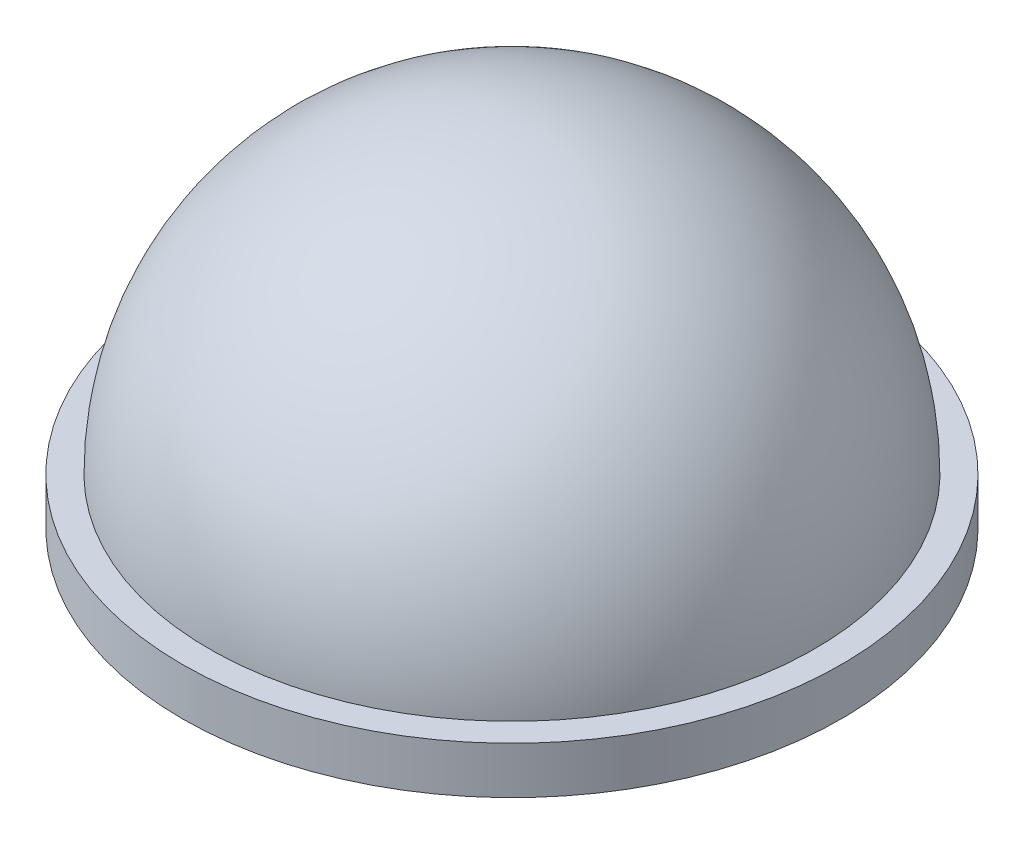
ISO-10303-21;
HEADER;
FILE_DESCRIPTION(('STEP AP214'),'2;1');
FILE_NAME('part.step','',(''),(''),'','','');
FILE_SCHEMA(('AUTOMOTIVE_DESIGN { 1 0 10303 214 1 1 1 1 }'));
ENDSEC;
DATA;
#1=APPLICATION_CONTEXT('core data for automotive mechanical design processes');
#2=APPLICATION_PROTOCOL_DEFINITION('international standard','automotive_design',2000,#1);
#3=PRODUCT_CONTEXT('',#1,'mechanical');
#4=PRODUCT('Part','Part','',(#3));
#5=PRODUCT_RELATED_PRODUCT_CATEGORY('part','',(#4));
#6=PRODUCT_DEFINITION_FORMATION('','',#4);
#7=PRODUCT_DEFINITION_CONTEXT('part definition',#1,'design');
#8=PRODUCT_DEFINITION('design','',#6,#7);
#9=PRODUCT_DEFINITION_SHAPE('','',#8);
#10=(LENGTH_UNIT() NAMED_UNIT(*) SI_UNIT(.MILLI.,.METRE.));
#11=(NAMED_UNIT(*) PLANE_ANGLE_UNIT() SI_UNIT($,.RADIAN.));
#12=(NAMED_UNIT(*) SI_UNIT($,.STERADIAN.) SOLID_ANGLE_UNIT());
#13=UNCERTAINTY_MEASURE_WITH_UNIT(LENGTH_MEASURE(1.E-05),#10,'distance_accuracy_value','');
#14=(GEOMETRIC_REPRESENTATION_CONTEXT(3) GLOBAL_UNCERTAINTY_ASSIGNED_CONTEXT((#13)) GLOBAL_UNIT_ASSIGNED_CONTEXT((#10,
#11,#12)) REPRESENTATION_CONTEXT('',''));
#15=CARTESIAN_POINT('',(0.,0.,0.));
#16=DIRECTION('',(0.,0.,1.));
#17=DIRECTION('',(1.,0.,0.));
#18=AXIS2_PLACEMENT_3D('',#15,#16,#17);
#19=CARTESIAN_POINT('',(0.,0.7,0.));
#20=DIRECTION('',(0.,-1.,0.));
#21=DIRECTION('',(0.,0.,-1.));
#22=AXIS2_PLACEMENT_3D('',#19,#20,#21);
#23=CYLINDRICAL_SURFACE('',#22,4.9);
#24=CARTESIAN_POINT('',(0.,0.7,0.));
#25=DIRECTION('',(0.,1.,0.));
#26=DIRECTION('',(0.,0.,1.));
#27=AXIS2_PLACEMENT_3D('',#24,#25,#26);
#28=CIRCLE('',#27,4.9);
#29=CARTESIAN_POINT('',(0.,0.7,4.9));
#30=VERTEX_POINT('',#29);
#31=EDGE_CURVE('E10',#30,#30,#28,.T.);
#32=ORIENTED_EDGE('',*,*,#31,.F.);
#33=EDGE_LOOP('',(#32));
#34=FACE_BOUND('',#33,.T.);
#35=CARTESIAN_POINT('',(0.,0.,0.));
#36=DIRECTION('',(0.,1.,0.));
#37=DIRECTION('',(0.,0.,1.));
#38=AXIS2_PLACEMENT_3D('',#35,#36,#37);
#39=CIRCLE('',#38,4.9);
#40=CARTESIAN_POINT('',(0.,0.,4.9));
#41=VERTEX_POINT('',#40);
#42=EDGE_CURVE('E46',#41,#41,#39,.T.);
#43=ORIENTED_EDGE('',*,*,#42,.T.);
#44=EDGE_LOOP('',(#43));
#45=FACE_BOUND('',#44,.T.);
#46=ADVANCED_FACE('F43',(#34,#45),#23,.T.);
#47=CARTESIAN_POINT('',(0.,0.7,0.));
#48=DIRECTION('',(0.,1.,0.));
#49=DIRECTION('',(0.,0.,1.));
#50=AXIS2_PLACEMENT_3D('',#47,#48,#49);
#51=PLANE('',#50);
#52=CARTESIAN_POINT('',(0.,0.7,0.));
#53=DIRECTION('',(0.,-1.,0.));
#54=DIRECTION('',(0.,0.,-1.));
#55=AXIS2_PLACEMENT_3D('',#52,#53,#54);
#56=CIRCLE('',#55,4.5);
#57=CARTESIAN_POINT('',(0.,0.7,-4.5));
#58=VERTEX_POINT('',#57);
#59=EDGE_CURVE('E55',#58,#58,#56,.T.);
#60=ORIENTED_EDGE('',*,*,#59,.T.);
#61=EDGE_LOOP('',(#60));
#62=FACE_BOUND('',#61,.T.);
#63=ORIENTED_EDGE('',*,*,#31,.T.);
#64=EDGE_LOOP('',(#63));
#65=FACE_BOUND('',#64,.T.);
#66=ADVANCED_FACE('F61',(#62,#65),#51,.T.);
#67=CARTESIAN_POINT('',(0.,0.,0.));
#68=DIRECTION('',(0.,1.,0.));
#69=DIRECTION('',(0.,0.,1.));
#70=AXIS2_PLACEMENT_3D('',#67,#68,#69);
#71=PLANE('',#70);
#72=ORIENTED_EDGE('',*,*,#42,.F.);
#73=EDGE_LOOP('',(#72));
#74=FACE_BOUND('',#73,.T.);
#75=ADVANCED_FACE('F65',(#74),#71,.F.);
#76=CARTESIAN_POINT('',(0.,0.7,0.));
#77=DIRECTION('',(0.,-1.,0.));
#78=DIRECTION('',(-1.,0.,0.));
#79=AXIS2_PLACEMENT_3D('',#76,#77,#78);
#80=SPHERICAL_SURFACE('',#79,4.5);
#81=ORIENTED_EDGE('',*,*,#59,.F.);
#82=EDGE_LOOP('',(#81));
#83=FACE_BOUND('',#82,.T.);
#84=ADVANCED_FACE('F63',(#83),#80,.T.);
#85=CLOSED_SHELL('',(#46,#66,#75,#84));
#86=MANIFOLD_SOLID_BREP('B2',#85);
#87=ADVANCED_BREP_SHAPE_REPRESENTATION('',(#18,#86),#14);
#88=SHAPE_DEFINITION_REPRESENTATION(#9,#87);
ENDSEC;
END-ISO-10303-21;
